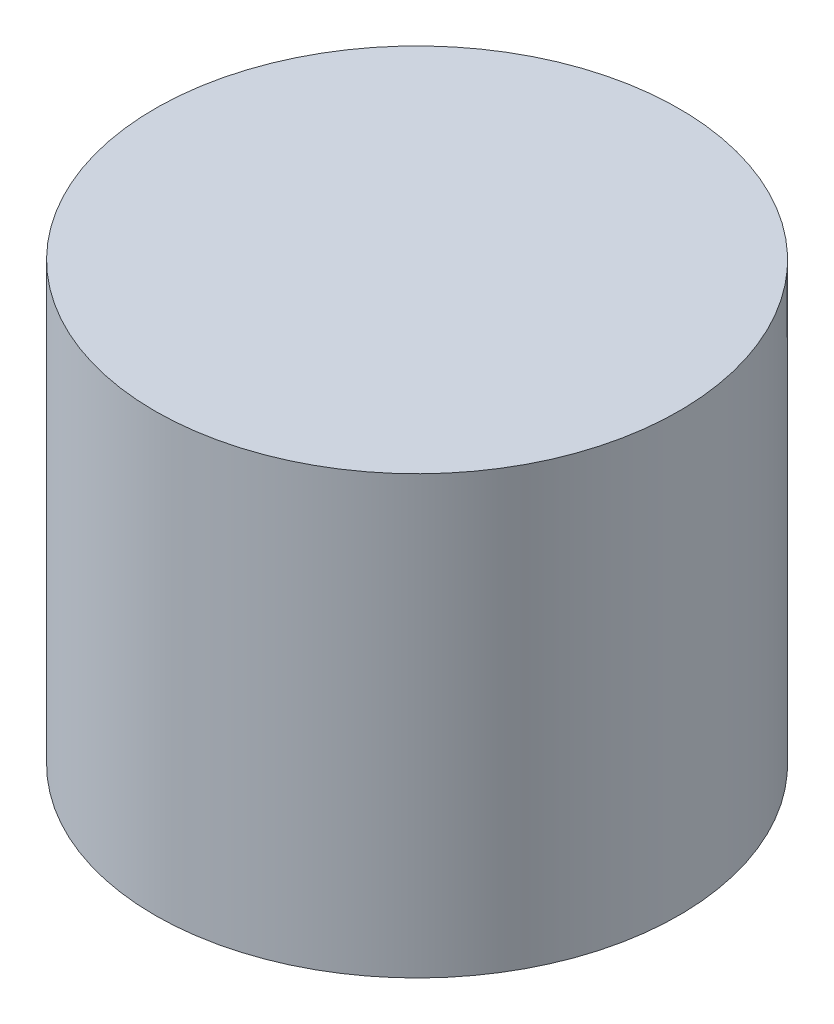
ISO-10303-21;
HEADER;
FILE_DESCRIPTION(('STEP AP214'),'2;1');
FILE_NAME('part.step','',(''),(''),'','','');
FILE_SCHEMA(('AUTOMOTIVE_DESIGN { 1 0 10303 214 1 1 1 1 }'));
ENDSEC;
DATA;
#1=APPLICATION_CONTEXT('core data for automotive mechanical design processes');
#2=APPLICATION_PROTOCOL_DEFINITION('international standard','automotive_design',2000,#1);
#3=PRODUCT_CONTEXT('',#1,'mechanical');
#4=PRODUCT('Part','Part','',(#3));
#5=PRODUCT_RELATED_PRODUCT_CATEGORY('part','',(#4));
#6=PRODUCT_DEFINITION_FORMATION('','',#4);
#7=PRODUCT_DEFINITION_CONTEXT('part definition',#1,'design');
#8=PRODUCT_DEFINITION('design','',#6,#7);
#9=PRODUCT_DEFINITION_SHAPE('','',#8);
#10=(LENGTH_UNIT() NAMED_UNIT(*) SI_UNIT(.MILLI.,.METRE.));
#11=(NAMED_UNIT(*) PLANE_ANGLE_UNIT() SI_UNIT($,.RADIAN.));
#12=(NAMED_UNIT(*) SI_UNIT($,.STERADIAN.) SOLID_ANGLE_UNIT());
#13=UNCERTAINTY_MEASURE_WITH_UNIT(LENGTH_MEASURE(1.E-05),#10,'distance_accuracy_value','');
#14=(GEOMETRIC_REPRESENTATION_CONTEXT(3) GLOBAL_UNCERTAINTY_ASSIGNED_CONTEXT((#13)) GLOBAL_UNIT_ASSIGNED_CONTEXT((#10,
#11,#12)) REPRESENTATION_CONTEXT('',''));
#15=CARTESIAN_POINT('',(0.,0.,0.));
#16=DIRECTION('',(0.,0.,1.));
#17=DIRECTION('',(1.,0.,0.));
#18=AXIS2_PLACEMENT_3D('',#15,#16,#17);
#19=CARTESIAN_POINT('',(0.,0.,0.));
#20=DIRECTION('',(0.,1.,0.));
#21=DIRECTION('',(0.,0.,1.));
#22=AXIS2_PLACEMENT_3D('',#19,#20,#21);
#23=PLANE('',#22);
#24=CARTESIAN_POINT('',(0.,0.,0.));
#25=DIRECTION('',(0.,1.,0.));
#26=DIRECTION('',(0.,0.,1.));
#27=AXIS2_PLACEMENT_3D('',#24,#25,#26);
#28=CIRCLE('',#27,19.05);
#29=CARTESIAN_POINT('',(0.,0.,19.05));
#30=VERTEX_POINT('',#29);
#31=EDGE_CURVE('E10',#30,#30,#28,.T.);
#32=ORIENTED_EDGE('',*,*,#31,.F.);
#33=EDGE_LOOP('',(#32));
#34=FACE_BOUND('',#33,.T.);
#35=CARTESIAN_POINT('',(0.,0.,0.));
#36=DIRECTION('',(0.,1.,0.));
#37=DIRECTION('',(0.,0.,1.));
#38=AXIS2_PLACEMENT_3D('',#35,#36,#37);
#39=CIRCLE('',#38,12.7);
#40=CARTESIAN_POINT('',(0.,0.,12.7));
#41=VERTEX_POINT('',#40);
#42=EDGE_CURVE('E42',#41,#41,#39,.T.);
#43=ORIENTED_EDGE('',*,*,#42,.T.);
#44=EDGE_LOOP('',(#43));
#45=FACE_BOUND('',#44,.T.);
#46=ADVANCED_FACE('F35',(#34,#45),#23,.F.);
#47=CARTESIAN_POINT('',(0.,25.4,0.));
#48=DIRECTION('',(0.,-1.,0.));
#49=DIRECTION('',(0.,0.,-1.));
#50=AXIS2_PLACEMENT_3D('',#47,#48,#49);
#51=CYLINDRICAL_SURFACE('',#50,19.05);
#52=ORIENTED_EDGE('',*,*,#31,.T.);
#53=EDGE_LOOP('',(#52));
#54=FACE_BOUND('',#53,.T.);
#55=CARTESIAN_POINT('',(0.,31.75,0.));
#56=DIRECTION('',(0.,1.,0.));
#57=DIRECTION('',(0.,0.,1.));
#58=AXIS2_PLACEMENT_3D('',#55,#56,#57);
#59=CIRCLE('',#58,19.05);
#60=CARTESIAN_POINT('',(0.,31.75,19.05));
#61=VERTEX_POINT('',#60);
#62=EDGE_CURVE('E50',#61,#61,#59,.T.);
#63=ORIENTED_EDGE('',*,*,#62,.F.);
#64=EDGE_LOOP('',(#63));
#65=FACE_BOUND('',#64,.T.);
#66=ADVANCED_FACE('F37',(#54,#65),#51,.T.);
#67=CARTESIAN_POINT('',(0.,25.4,0.));
#68=DIRECTION('',(0.,-1.,0.));
#69=DIRECTION('',(0.,0.,-1.));
#70=AXIS2_PLACEMENT_3D('',#67,#68,#69);
#71=CYLINDRICAL_SURFACE('',#70,12.7);
#72=CARTESIAN_POINT('',(0.,25.4,0.));
#73=DIRECTION('',(0.,1.,0.));
#74=DIRECTION('',(0.,0.,1.));
#75=AXIS2_PLACEMENT_3D('',#72,#73,#74);
#76=CIRCLE('',#75,12.7);
#77=CARTESIAN_POINT('',(0.,25.4,12.7));
#78=VERTEX_POINT('',#77);
#79=EDGE_CURVE('E46',#78,#78,#76,.T.);
#80=ORIENTED_EDGE('',*,*,#79,.T.);
#81=EDGE_LOOP('',(#80));
#82=FACE_BOUND('',#81,.T.);
#83=ORIENTED_EDGE('',*,*,#42,.F.);
#84=EDGE_LOOP('',(#83));
#85=FACE_BOUND('',#84,.T.);
#86=ADVANCED_FACE('F59',(#82,#85),#71,.F.);
#87=CARTESIAN_POINT('',(0.,25.4,0.));
#88=DIRECTION('',(0.,1.,0.));
#89=DIRECTION('',(0.,0.,1.));
#90=AXIS2_PLACEMENT_3D('',#87,#88,#89);
#91=PLANE('',#90);
#92=ORIENTED_EDGE('',*,*,#79,.F.);
#93=EDGE_LOOP('',(#92));
#94=FACE_BOUND('',#93,.T.);
#95=ADVANCED_FACE('F64',(#94),#91,.F.);
#96=CARTESIAN_POINT('',(0.,31.75,0.));
#97=DIRECTION('',(0.,1.,0.));
#98=DIRECTION('',(0.,0.,1.));
#99=AXIS2_PLACEMENT_3D('',#96,#97,#98);
#100=PLANE('',#99);
#101=ORIENTED_EDGE('',*,*,#62,.T.);
#102=EDGE_LOOP('',(#101));
#103=FACE_BOUND('',#102,.T.);
#104=ADVANCED_FACE('F56',(#103),#100,.T.);
#105=CLOSED_SHELL('',(#46,#66,#86,#95,#104));
#106=MANIFOLD_SOLID_BREP('B2',#105);
#107=ADVANCED_BREP_SHAPE_REPRESENTATION('',(#18,#106),#14);
#108=SHAPE_DEFINITION_REPRESENTATION(#9,#107);
ENDSEC;
END-ISO-10303-21;
